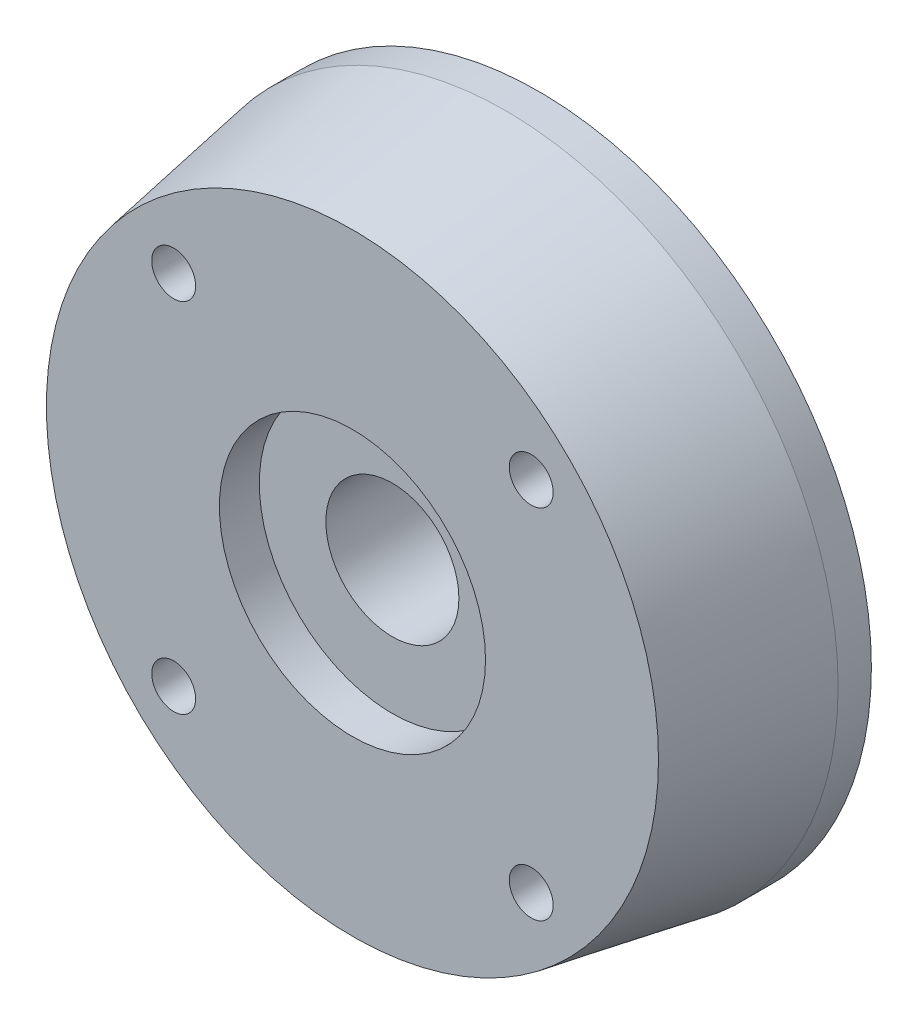
ISO-10303-21;
HEADER;
FILE_DESCRIPTION(('STEP AP214'),'2;1');
FILE_NAME('part.step','',(''),(''),'','','');
FILE_SCHEMA(('AUTOMOTIVE_DESIGN { 1 0 10303 214 1 1 1 1 }'));
ENDSEC;
DATA;
#1=APPLICATION_CONTEXT('core data for automotive mechanical design processes');
#2=APPLICATION_PROTOCOL_DEFINITION('international standard','automotive_design',2000,#1);
#3=PRODUCT_CONTEXT('',#1,'mechanical');
#4=PRODUCT('Part','Part','',(#3));
#5=PRODUCT_RELATED_PRODUCT_CATEGORY('part','',(#4));
#6=PRODUCT_DEFINITION_FORMATION('','',#4);
#7=PRODUCT_DEFINITION_CONTEXT('part definition',#1,'design');
#8=PRODUCT_DEFINITION('design','',#6,#7);
#9=PRODUCT_DEFINITION_SHAPE('','',#8);
#10=(LENGTH_UNIT() NAMED_UNIT(*) SI_UNIT(.MILLI.,.METRE.));
#11=(NAMED_UNIT(*) PLANE_ANGLE_UNIT() SI_UNIT($,.RADIAN.));
#12=(NAMED_UNIT(*) SI_UNIT($,.STERADIAN.) SOLID_ANGLE_UNIT());
#13=UNCERTAINTY_MEASURE_WITH_UNIT(LENGTH_MEASURE(1.E-05),#10,'distance_accuracy_value','');
#14=(GEOMETRIC_REPRESENTATION_CONTEXT(3) GLOBAL_UNCERTAINTY_ASSIGNED_CONTEXT((#13)) GLOBAL_UNIT_ASSIGNED_CONTEXT((#10,
#11,#12)) REPRESENTATION_CONTEXT('',''));
#15=CARTESIAN_POINT('',(0.,0.,0.));
#16=DIRECTION('',(0.,0.,1.));
#17=DIRECTION('',(1.,0.,0.));
#18=AXIS2_PLACEMENT_3D('',#15,#16,#17);
#19=CARTESIAN_POINT('',(0.,0.,14.));
#20=DIRECTION('',(0.,0.,-1.));
#21=DIRECTION('',(-1.,0.,0.));
#22=AXIS2_PLACEMENT_3D('',#19,#20,#21);
#23=CYLINDRICAL_SURFACE('',#22,25.);
#24=CARTESIAN_POINT('',(0.,0.,0.));
#25=DIRECTION('',(0.,0.,1.));
#26=DIRECTION('',(1.,0.,0.));
#27=AXIS2_PLACEMENT_3D('',#24,#25,#26);
#28=CIRCLE('',#27,25.);
#29=CARTESIAN_POINT('',(25.,0.,0.));
#30=VERTEX_POINT('',#29);
#31=EDGE_CURVE('E10',#30,#30,#28,.T.);
#32=ORIENTED_EDGE('',*,*,#31,.T.);
#33=EDGE_LOOP('',(#32));
#34=FACE_BOUND('',#33,.T.);
#35=CARTESIAN_POINT('',(0.,0.,2.5));
#36=DIRECTION('',(0.,0.,1.));
#37=DIRECTION('',(1.,0.,0.));
#38=AXIS2_PLACEMENT_3D('',#35,#36,#37);
#39=CIRCLE('',#38,25.);
#40=CARTESIAN_POINT('',(25.,0.,2.5));
#41=VERTEX_POINT('',#40);
#42=EDGE_CURVE('E40',#41,#41,#39,.T.);
#43=ORIENTED_EDGE('',*,*,#42,.F.);
#44=EDGE_LOOP('',(#43));
#45=FACE_BOUND('',#44,.T.);
#46=ADVANCED_FACE('F34',(#34,#45),#23,.T.);
#47=CARTESIAN_POINT('',(0.,0.,0.));
#48=DIRECTION('',(0.,0.,1.));
#49=DIRECTION('',(1.,0.,0.));
#50=AXIS2_PLACEMENT_3D('',#47,#48,#49);
#51=PLANE('',#50);
#52=CARTESIAN_POINT('',(0.,0.,0.));
#53=DIRECTION('',(0.,0.,1.));
#54=DIRECTION('',(1.,0.,0.));
#55=AXIS2_PLACEMENT_3D('',#52,#53,#54);
#56=CIRCLE('',#55,5.);
#57=CARTESIAN_POINT('',(5.,0.,0.));
#58=VERTEX_POINT('',#57);
#59=EDGE_CURVE('E78',#58,#58,#56,.T.);
#60=ORIENTED_EDGE('',*,*,#59,.T.);
#61=EDGE_LOOP('',(#60));
#62=FACE_BOUND('',#61,.T.);
#63=CARTESIAN_POINT('',(13.4350288425446,-13.4350288425442,0.));
#64=DIRECTION('',(0.,0.,1.));
#65=DIRECTION('',(1.,0.,0.));
#66=AXIS2_PLACEMENT_3D('',#63,#64,#65);
#67=CIRCLE('',#66,1.65);
#68=CARTESIAN_POINT('',(15.0850288425446,-13.4350288425442,0.));
#69=VERTEX_POINT('',#68);
#70=EDGE_CURVE('E68',#69,#69,#67,.T.);
#71=ORIENTED_EDGE('',*,*,#70,.T.);
#72=EDGE_LOOP('',(#71));
#73=FACE_BOUND('',#72,.T.);
#74=CARTESIAN_POINT('',(-13.4350288425444,-13.4350288425444,0.));
#75=DIRECTION('',(0.,0.,1.));
#76=DIRECTION('',(1.,0.,0.));
#77=AXIS2_PLACEMENT_3D('',#74,#75,#76);
#78=CIRCLE('',#77,1.65);
#79=CARTESIAN_POINT('',(-11.7850288425444,-13.4350288425444,0.));
#80=VERTEX_POINT('',#79);
#81=EDGE_CURVE('E62',#80,#80,#78,.T.);
#82=ORIENTED_EDGE('',*,*,#81,.T.);
#83=EDGE_LOOP('',(#82));
#84=FACE_BOUND('',#83,.T.);
#85=CARTESIAN_POINT('',(-13.4350288425445,13.4350288425443,0.));
#86=DIRECTION('',(0.,0.,1.));
#87=DIRECTION('',(1.,0.,0.));
#88=AXIS2_PLACEMENT_3D('',#85,#86,#87);
#89=CIRCLE('',#88,1.65);
#90=CARTESIAN_POINT('',(-11.7850288425445,13.4350288425443,0.));
#91=VERTEX_POINT('',#90);
#92=EDGE_CURVE('E56',#91,#91,#89,.T.);
#93=ORIENTED_EDGE('',*,*,#92,.T.);
#94=EDGE_LOOP('',(#93));
#95=FACE_BOUND('',#94,.T.);
#96=CARTESIAN_POINT('',(13.4350288425444,13.4350288425444,0.));
#97=DIRECTION('',(0.,0.,1.));
#98=DIRECTION('',(1.,0.,0.));
#99=AXIS2_PLACEMENT_3D('',#96,#97,#98);
#100=CIRCLE('',#99,1.65);
#101=CARTESIAN_POINT('',(15.0850288425444,13.4350288425444,0.));
#102=VERTEX_POINT('',#101);
#103=EDGE_CURVE('E48',#102,#102,#100,.T.);
#104=ORIENTED_EDGE('',*,*,#103,.T.);
#105=EDGE_LOOP('',(#104));
#106=FACE_BOUND('',#105,.T.);
#107=ORIENTED_EDGE('',*,*,#31,.F.);
#108=EDGE_LOOP('',(#107));
#109=FACE_BOUND('',#108,.T.);
#110=ADVANCED_FACE('F87',(#62,#73,#84,#95,#106,#109),#51,.F.);
#111=CARTESIAN_POINT('',(0.,0.,14.));
#112=DIRECTION('',(0.,0.,-1.));
#113=DIRECTION('',(-1.,0.,0.));
#114=AXIS2_PLACEMENT_3D('',#111,#112,#113);
#115=CONICAL_SURFACE('',#114,23.,0.172190814522939);
#116=ORIENTED_EDGE('',*,*,#42,.T.);
#117=EDGE_LOOP('',(#116));
#118=FACE_BOUND('',#117,.T.);
#119=CARTESIAN_POINT('',(0.,0.,14.));
#120=DIRECTION('',(0.,0.,1.));
#121=DIRECTION('',(1.,0.,0.));
#122=AXIS2_PLACEMENT_3D('',#119,#120,#121);
#123=CIRCLE('',#122,23.);
#124=CARTESIAN_POINT('',(23.,0.,14.));
#125=VERTEX_POINT('',#124);
#126=EDGE_CURVE('E44',#125,#125,#123,.T.);
#127=ORIENTED_EDGE('',*,*,#126,.F.);
#128=EDGE_LOOP('',(#127));
#129=FACE_BOUND('',#128,.T.);
#130=ADVANCED_FACE('F113',(#118,#129),#115,.T.);
#131=CARTESIAN_POINT('',(0.,0.,14.));
#132=DIRECTION('',(0.,0.,1.));
#133=DIRECTION('',(1.,0.,0.));
#134=AXIS2_PLACEMENT_3D('',#131,#132,#133);
#135=PLANE('',#134);
#136=CARTESIAN_POINT('',(0.,0.,14.));
#137=DIRECTION('',(0.,0.,1.));
#138=DIRECTION('',(1.,0.,0.));
#139=AXIS2_PLACEMENT_3D('',#136,#137,#138);
#140=CIRCLE('',#139,10.);
#141=CARTESIAN_POINT('',(10.,0.,14.));
#142=VERTEX_POINT('',#141);
#143=EDGE_CURVE('E75',#142,#142,#140,.T.);
#144=ORIENTED_EDGE('',*,*,#143,.F.);
#145=EDGE_LOOP('',(#144));
#146=FACE_BOUND('',#145,.T.);
#147=CARTESIAN_POINT('',(13.4350288425446,-13.4350288425442,14.));
#148=DIRECTION('',(0.,0.,1.));
#149=DIRECTION('',(1.,0.,0.));
#150=AXIS2_PLACEMENT_3D('',#147,#148,#149);
#151=CIRCLE('',#150,1.64999999999999);
#152=CARTESIAN_POINT('',(15.0850288425446,-13.4350288425442,14.));
#153=VERTEX_POINT('',#152);
#154=EDGE_CURVE('E71',#153,#153,#151,.T.);
#155=ORIENTED_EDGE('',*,*,#154,.F.);
#156=EDGE_LOOP('',(#155));
#157=FACE_BOUND('',#156,.T.);
#158=CARTESIAN_POINT('',(-13.4350288425444,-13.4350288425444,14.));
#159=DIRECTION('',(0.,0.,1.));
#160=DIRECTION('',(1.,0.,0.));
#161=AXIS2_PLACEMENT_3D('',#158,#159,#160);
#162=CIRCLE('',#161,1.64999999999999);
#163=CARTESIAN_POINT('',(-11.7850288425444,-13.4350288425444,14.));
#164=VERTEX_POINT('',#163);
#165=EDGE_CURVE('E65',#164,#164,#162,.T.);
#166=ORIENTED_EDGE('',*,*,#165,.F.);
#167=EDGE_LOOP('',(#166));
#168=FACE_BOUND('',#167,.T.);
#169=CARTESIAN_POINT('',(-13.4350288425445,13.4350288425443,14.));
#170=DIRECTION('',(0.,0.,1.));
#171=DIRECTION('',(1.,0.,0.));
#172=AXIS2_PLACEMENT_3D('',#169,#170,#171);
#173=CIRCLE('',#172,1.64999999999999);
#174=CARTESIAN_POINT('',(-11.7850288425445,13.4350288425443,14.));
#175=VERTEX_POINT('',#174);
#176=EDGE_CURVE('E59',#175,#175,#173,.T.);
#177=ORIENTED_EDGE('',*,*,#176,.F.);
#178=EDGE_LOOP('',(#177));
#179=FACE_BOUND('',#178,.T.);
#180=CARTESIAN_POINT('',(13.4350288425444,13.4350288425444,14.));
#181=DIRECTION('',(0.,0.,1.));
#182=DIRECTION('',(1.,0.,0.));
#183=AXIS2_PLACEMENT_3D('',#180,#181,#182);
#184=CIRCLE('',#183,1.64999999999999);
#185=CARTESIAN_POINT('',(15.0850288425444,13.4350288425444,14.));
#186=VERTEX_POINT('',#185);
#187=EDGE_CURVE('E53',#186,#186,#184,.T.);
#188=ORIENTED_EDGE('',*,*,#187,.F.);
#189=EDGE_LOOP('',(#188));
#190=FACE_BOUND('',#189,.T.);
#191=ORIENTED_EDGE('',*,*,#126,.T.);
#192=EDGE_LOOP('',(#191));
#193=FACE_BOUND('',#192,.T.);
#194=ADVANCED_FACE('F109',(#146,#157,#168,#179,#190,#193),#135,.T.);
#195=CARTESIAN_POINT('',(13.4350288425444,13.4350288425444,14.));
#196=DIRECTION('',(0.,0.,1.));
#197=DIRECTION('',(1.,0.,0.));
#198=AXIS2_PLACEMENT_3D('',#195,#196,#197);
#199=CYLINDRICAL_SURFACE('',#198,1.64999999999999);
#200=ORIENTED_EDGE('',*,*,#103,.F.);
#201=EDGE_LOOP('',(#200));
#202=FACE_BOUND('',#201,.T.);
#203=ORIENTED_EDGE('',*,*,#187,.T.);
#204=EDGE_LOOP('',(#203));
#205=FACE_BOUND('',#204,.T.);
#206=ADVANCED_FACE('F112',(#202,#205),#199,.F.);
#207=CARTESIAN_POINT('',(-13.4350288425445,13.4350288425443,14.));
#208=DIRECTION('',(0.,0.,1.));
#209=DIRECTION('',(1.,0.,0.));
#210=AXIS2_PLACEMENT_3D('',#207,#208,#209);
#211=CYLINDRICAL_SURFACE('',#210,1.64999999999999);
#212=ORIENTED_EDGE('',*,*,#92,.F.);
#213=EDGE_LOOP('',(#212));
#214=FACE_BOUND('',#213,.T.);
#215=ORIENTED_EDGE('',*,*,#176,.T.);
#216=EDGE_LOOP('',(#215));
#217=FACE_BOUND('',#216,.T.);
#218=ADVANCED_FACE('F174',(#214,#217),#211,.F.);
#219=CARTESIAN_POINT('',(-13.4350288425444,-13.4350288425444,14.));
#220=DIRECTION('',(0.,0.,1.));
#221=DIRECTION('',(1.,0.,0.));
#222=AXIS2_PLACEMENT_3D('',#219,#220,#221);
#223=CYLINDRICAL_SURFACE('',#222,1.64999999999999);
#224=ORIENTED_EDGE('',*,*,#81,.F.);
#225=EDGE_LOOP('',(#224));
#226=FACE_BOUND('',#225,.T.);
#227=ORIENTED_EDGE('',*,*,#165,.T.);
#228=EDGE_LOOP('',(#227));
#229=FACE_BOUND('',#228,.T.);
#230=ADVANCED_FACE('F165',(#226,#229),#223,.F.);
#231=CARTESIAN_POINT('',(13.4350288425446,-13.4350288425442,14.));
#232=DIRECTION('',(0.,0.,1.));
#233=DIRECTION('',(1.,0.,0.));
#234=AXIS2_PLACEMENT_3D('',#231,#232,#233);
#235=CYLINDRICAL_SURFACE('',#234,1.64999999999999);
#236=ORIENTED_EDGE('',*,*,#70,.F.);
#237=EDGE_LOOP('',(#236));
#238=FACE_BOUND('',#237,.T.);
#239=ORIENTED_EDGE('',*,*,#154,.T.);
#240=EDGE_LOOP('',(#239));
#241=FACE_BOUND('',#240,.T.);
#242=ADVANCED_FACE('F105',(#238,#241),#235,.F.);
#243=CARTESIAN_POINT('',(0.,0.,11.));
#244=DIRECTION('',(0.,0.,1.));
#245=DIRECTION('',(1.,0.,0.));
#246=AXIS2_PLACEMENT_3D('',#243,#244,#245);
#247=CYLINDRICAL_SURFACE('',#246,10.);
#248=CARTESIAN_POINT('',(0.,0.,11.));
#249=DIRECTION('',(0.,0.,1.));
#250=DIRECTION('',(1.,0.,0.));
#251=AXIS2_PLACEMENT_3D('',#248,#249,#250);
#252=CIRCLE('',#251,10.);
#253=CARTESIAN_POINT('',(10.,0.,11.));
#254=VERTEX_POINT('',#253);
#255=EDGE_CURVE('E74',#254,#254,#252,.T.);
#256=ORIENTED_EDGE('',*,*,#255,.F.);
#257=EDGE_LOOP('',(#256));
#258=FACE_BOUND('',#257,.T.);
#259=ORIENTED_EDGE('',*,*,#143,.T.);
#260=EDGE_LOOP('',(#259));
#261=FACE_BOUND('',#260,.T.);
#262=ADVANCED_FACE('F99',(#258,#261),#247,.F.);
#263=CARTESIAN_POINT('',(0.,0.,11.));
#264=DIRECTION('',(0.,0.,1.));
#265=DIRECTION('',(1.,0.,0.));
#266=AXIS2_PLACEMENT_3D('',#263,#264,#265);
#267=PLANE('',#266);
#268=CARTESIAN_POINT('',(0.,0.,11.));
#269=DIRECTION('',(0.,0.,1.));
#270=DIRECTION('',(1.,0.,0.));
#271=AXIS2_PLACEMENT_3D('',#268,#269,#270);
#272=CIRCLE('',#271,5.);
#273=CARTESIAN_POINT('',(5.,0.,11.));
#274=VERTEX_POINT('',#273);
#275=EDGE_CURVE('E81',#274,#274,#272,.T.);
#276=ORIENTED_EDGE('',*,*,#275,.F.);
#277=EDGE_LOOP('',(#276));
#278=FACE_BOUND('',#277,.T.);
#279=ORIENTED_EDGE('',*,*,#255,.T.);
#280=EDGE_LOOP('',(#279));
#281=FACE_BOUND('',#280,.T.);
#282=ADVANCED_FACE('F93',(#278,#281),#267,.T.);
#283=CARTESIAN_POINT('',(0.,0.,0.));
#284=DIRECTION('',(0.,0.,1.));
#285=DIRECTION('',(1.,0.,0.));
#286=AXIS2_PLACEMENT_3D('',#283,#284,#285);
#287=CYLINDRICAL_SURFACE('',#286,5.);
#288=ORIENTED_EDGE('',*,*,#59,.F.);
#289=EDGE_LOOP('',(#288));
#290=FACE_BOUND('',#289,.T.);
#291=ORIENTED_EDGE('',*,*,#275,.T.);
#292=EDGE_LOOP('',(#291));
#293=FACE_BOUND('',#292,.T.);
#294=ADVANCED_FACE('F90',(#290,#293),#287,.F.);
#295=CLOSED_SHELL('',(#46,#110,#130,#194,#206,#218,#230,#242,#262,#282,#294));
#296=MANIFOLD_SOLID_BREP('B2',#295);
#297=ADVANCED_BREP_SHAPE_REPRESENTATION('',(#18,#296),#14);
#298=SHAPE_DEFINITION_REPRESENTATION(#9,#297);
ENDSEC;
END-ISO-10303-21;
